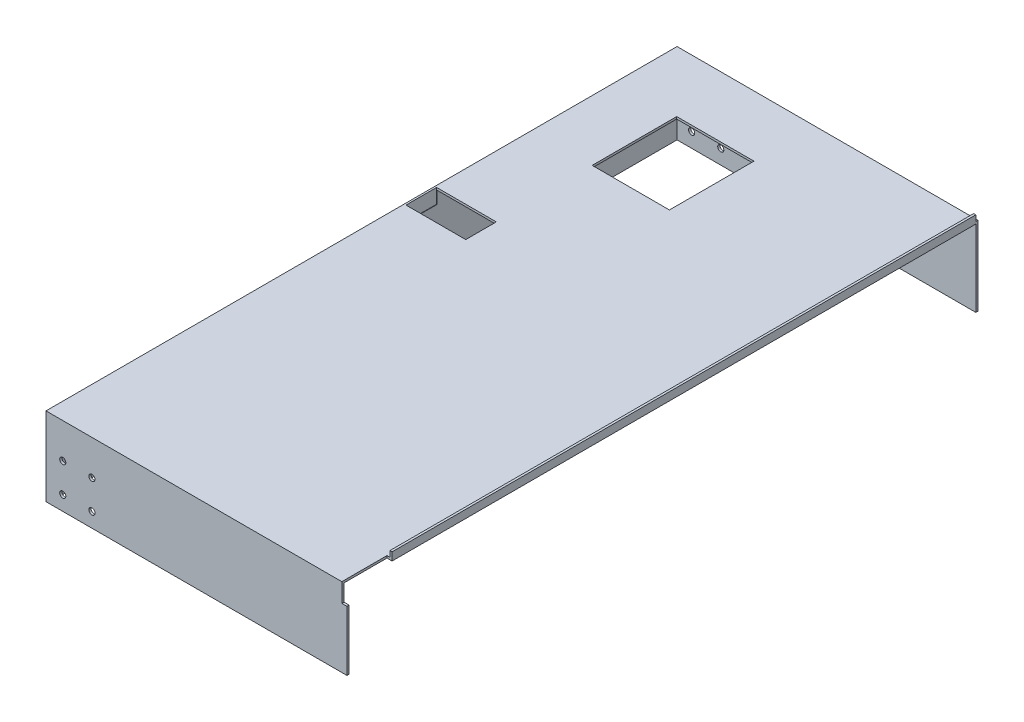
ISO-10303-21;
HEADER;
FILE_DESCRIPTION(('STEP AP214'),'2;1');
FILE_NAME('part.step','',(''),(''),'','','');
FILE_SCHEMA(('AUTOMOTIVE_DESIGN { 1 0 10303 214 1 1 1 1 }'));
ENDSEC;
DATA;
#1=APPLICATION_CONTEXT('core data for automotive mechanical design processes');
#2=APPLICATION_PROTOCOL_DEFINITION('international standard','automotive_design',2000,#1);
#3=PRODUCT_CONTEXT('',#1,'mechanical');
#4=PRODUCT('Part','Part','',(#3));
#5=PRODUCT_RELATED_PRODUCT_CATEGORY('part','',(#4));
#6=PRODUCT_DEFINITION_FORMATION('','',#4);
#7=PRODUCT_DEFINITION_CONTEXT('part definition',#1,'design');
#8=PRODUCT_DEFINITION('design','',#6,#7);
#9=PRODUCT_DEFINITION_SHAPE('','',#8);
#10=(LENGTH_UNIT() NAMED_UNIT(*) SI_UNIT(.MILLI.,.METRE.));
#11=(NAMED_UNIT(*) PLANE_ANGLE_UNIT() SI_UNIT($,.RADIAN.));
#12=(NAMED_UNIT(*) SI_UNIT($,.STERADIAN.) SOLID_ANGLE_UNIT());
#13=UNCERTAINTY_MEASURE_WITH_UNIT(LENGTH_MEASURE(1.E-05),#10,'distance_accuracy_value','');
#14=(GEOMETRIC_REPRESENTATION_CONTEXT(3) GLOBAL_UNCERTAINTY_ASSIGNED_CONTEXT((#13)) GLOBAL_UNIT_ASSIGNED_CONTEXT((#10,
#11,#12)) REPRESENTATION_CONTEXT('',''));
#15=CARTESIAN_POINT('',(0.,0.,0.));
#16=DIRECTION('',(0.,0.,1.));
#17=DIRECTION('',(1.,0.,0.));
#18=AXIS2_PLACEMENT_3D('',#15,#16,#17);
#19=CARTESIAN_POINT('',(329.013477330326,1.5,-430.));
#20=DIRECTION('',(-1.,0.,0.));
#21=DIRECTION('',(0.,0.,1.));
#22=AXIS2_PLACEMENT_3D('',#19,#20,#21);
#23=PLANE('',#22);
#24=DIRECTION('',(0.,1.,0.));
#25=VECTOR('',#24,1.);
#26=CARTESIAN_POINT('',(329.013477330326,6.22834047165099,-29.5));
#27=LINE('',#26,#25);
#28=CARTESIAN_POINT('',(329.013477330326,0.,-29.5));
#29=VERTEX_POINT('',#28);
#30=CARTESIAN_POINT('',(329.013477330326,5.5,-29.5));
#31=VERTEX_POINT('',#30);
#32=EDGE_CURVE('E48',#29,#31,#27,.T.);
#33=ORIENTED_EDGE('',*,*,#32,.F.);
#34=DIRECTION('',(0.,0.,-1.));
#35=VECTOR('',#34,1.);
#36=CARTESIAN_POINT('',(329.013477330326,0.,-430.));
#37=LINE('',#36,#35);
#38=CARTESIAN_POINT('',(329.013477330326,0.,-430.));
#39=VERTEX_POINT('',#38);
#40=EDGE_CURVE('E407',#29,#39,#37,.T.);
#41=ORIENTED_EDGE('',*,*,#40,.T.);
#42=DIRECTION('',(0.,-1.,0.));
#43=VECTOR('',#42,1.);
#44=CARTESIAN_POINT('',(329.013477330326,1.49999999999998,-430.));
#45=LINE('',#44,#43);
#46=CARTESIAN_POINT('',(329.013477330326,-52.5,-430.));
#47=VERTEX_POINT('',#46);
#48=EDGE_CURVE('E358',#39,#47,#45,.T.);
#49=ORIENTED_EDGE('',*,*,#48,.T.);
#50=DIRECTION('',(0.,0.,1.));
#51=VECTOR('',#50,1.);
#52=CARTESIAN_POINT('',(329.013477330326,-52.5,-431.5));
#53=LINE('',#52,#51);
#54=CARTESIAN_POINT('',(329.013477330326,-52.5,-431.5));
#55=VERTEX_POINT('',#54);
#56=EDGE_CURVE('E355',#55,#47,#53,.T.);
#57=ORIENTED_EDGE('',*,*,#56,.F.);
#58=DIRECTION('',(0.,-1.,0.));
#59=VECTOR('',#58,1.);
#60=CARTESIAN_POINT('',(329.013477330326,1.49999999999998,-431.5));
#61=LINE('',#60,#59);
#62=CARTESIAN_POINT('',(329.013477330326,1.49999999999998,-431.5));
#63=VERTEX_POINT('',#62);
#64=EDGE_CURVE('E350',#63,#55,#61,.T.);
#65=ORIENTED_EDGE('',*,*,#64,.F.);
#66=DIRECTION('',(0.,0.,1.));
#67=VECTOR('',#66,1.);
#68=CARTESIAN_POINT('',(329.013477330326,1.49999999999998,-431.5));
#69=LINE('',#68,#67);
#70=CARTESIAN_POINT('',(329.013477330326,1.49999999999998,-430.));
#71=VERTEX_POINT('',#70);
#72=EDGE_CURVE('E368',#63,#71,#69,.T.);
#73=ORIENTED_EDGE('',*,*,#72,.T.);
#74=DIRECTION('',(0.,-1.,0.));
#75=VECTOR('',#74,1.);
#76=CARTESIAN_POINT('',(329.013477330326,1.5,-430.));
#77=LINE('',#76,#75);
#78=CARTESIAN_POINT('',(329.013477330326,5.5,-430.));
#79=VERTEX_POINT('',#78);
#80=EDGE_CURVE('E363',#79,#71,#77,.T.);
#81=ORIENTED_EDGE('',*,*,#80,.F.);
#82=DIRECTION('',(0.,0.,-1.));
#83=VECTOR('',#82,1.);
#84=CARTESIAN_POINT('',(329.013477330326,5.5,0.));
#85=LINE('',#84,#83);
#86=EDGE_CURVE('E372',#31,#79,#85,.T.);
#87=ORIENTED_EDGE('',*,*,#86,.F.);
#88=EDGE_LOOP('',(#33,#41,#49,#57,#65,#73,#81,#87));
#89=FACE_BOUND('',#88,.T.);
#90=ADVANCED_FACE('F33',(#89),#23,.F.);
#91=CARTESIAN_POINT('',(327.513477330326,5.5,0.));
#92=DIRECTION('',(1.,0.,0.));
#93=DIRECTION('',(0.,0.,-1.));
#94=AXIS2_PLACEMENT_3D('',#91,#92,#93);
#95=PLANE('',#94);
#96=DIRECTION('',(0.,-1.,0.));
#97=VECTOR('',#96,1.);
#98=CARTESIAN_POINT('',(327.513477330326,5.5,-29.5));
#99=LINE('',#98,#97);
#100=CARTESIAN_POINT('',(327.513477330326,5.5,-29.5));
#101=VERTEX_POINT('',#100);
#102=CARTESIAN_POINT('',(327.513477330326,1.5,-29.5));
#103=VERTEX_POINT('',#102);
#104=EDGE_CURVE('E229',#101,#103,#99,.T.);
#105=ORIENTED_EDGE('',*,*,#104,.F.);
#106=DIRECTION('',(0.,0.,1.));
#107=VECTOR('',#106,1.);
#108=CARTESIAN_POINT('',(327.513477330326,5.5,0.));
#109=LINE('',#108,#107);
#110=CARTESIAN_POINT('',(327.513477330326,5.5,-430.));
#111=VERTEX_POINT('',#110);
#112=EDGE_CURVE('E376',#111,#101,#109,.T.);
#113=ORIENTED_EDGE('',*,*,#112,.F.);
#114=DIRECTION('',(0.,-1.,0.));
#115=VECTOR('',#114,1.);
#116=CARTESIAN_POINT('',(327.513477330326,5.5,-430.));
#117=LINE('',#116,#115);
#118=CARTESIAN_POINT('',(327.513477330326,1.5,-430.));
#119=VERTEX_POINT('',#118);
#120=EDGE_CURVE('E379',#111,#119,#117,.T.);
#121=ORIENTED_EDGE('',*,*,#120,.T.);
#122=DIRECTION('',(0.,0.,1.));
#123=VECTOR('',#122,1.);
#124=CARTESIAN_POINT('',(327.513477330326,1.5,0.));
#125=LINE('',#124,#123);
#126=EDGE_CURVE('E371',#119,#103,#125,.T.);
#127=ORIENTED_EDGE('',*,*,#126,.T.);
#128=EDGE_LOOP('',(#105,#113,#121,#127));
#129=FACE_BOUND('',#128,.T.);
#130=ADVANCED_FACE('F453',(#129),#95,.F.);
#131=CARTESIAN_POINT('',(0.,5.5,0.));
#132=DIRECTION('',(0.,1.,0.));
#133=DIRECTION('',(0.,0.,1.));
#134=AXIS2_PLACEMENT_3D('',#131,#132,#133);
#135=PLANE('',#134);
#136=ORIENTED_EDGE('',*,*,#112,.T.);
#137=DIRECTION('',(1.,0.,0.));
#138=VECTOR('',#137,1.);
#139=CARTESIAN_POINT('',(0.,5.5,-29.5));
#140=LINE('',#139,#138);
#141=EDGE_CURVE('E41',#101,#31,#140,.T.);
#142=ORIENTED_EDGE('',*,*,#141,.T.);
#143=ORIENTED_EDGE('',*,*,#86,.T.);
#144=DIRECTION('',(-1.,0.,0.));
#145=VECTOR('',#144,1.);
#146=CARTESIAN_POINT('',(329.013477330326,5.5,-430.));
#147=LINE('',#146,#145);
#148=EDGE_CURVE('E374',#79,#111,#147,.T.);
#149=ORIENTED_EDGE('',*,*,#148,.T.);
#150=EDGE_LOOP('',(#136,#142,#143,#149));
#151=FACE_BOUND('',#150,.T.);
#152=ADVANCED_FACE('F439',(#151),#135,.T.);
#153=CARTESIAN_POINT('',(124.013477330326,1.5,-430.));
#154=DIRECTION('',(0.,0.,1.));
#155=DIRECTION('',(1.,0.,0.));
#156=AXIS2_PLACEMENT_3D('',#153,#154,#155);
#157=PLANE('',#156);
#158=DIRECTION('',(1.,0.,0.));
#159=VECTOR('',#158,1.);
#160=CARTESIAN_POINT('',(124.013477330326,1.5,-430.));
#161=LINE('',#160,#159);
#162=EDGE_CURVE('E359',#119,#71,#161,.T.);
#163=ORIENTED_EDGE('',*,*,#162,.F.);
#164=ORIENTED_EDGE('',*,*,#120,.F.);
#165=ORIENTED_EDGE('',*,*,#148,.F.);
#166=ORIENTED_EDGE('',*,*,#80,.T.);
#167=EDGE_LOOP('',(#163,#164,#165,#166));
#168=FACE_BOUND('',#167,.T.);
#169=ADVANCED_FACE('F450',(#168),#157,.F.);
#170=CARTESIAN_POINT('',(0.,1.5,0.));
#171=DIRECTION('',(0.,-1.,0.));
#172=DIRECTION('',(0.,0.,-1.));
#173=AXIS2_PLACEMENT_3D('',#170,#171,#172);
#174=PLANE('',#173);
#175=DIRECTION('',(1.,0.,0.));
#176=VECTOR('',#175,1.);
#177=CARTESIAN_POINT('',(164.013477330328,1.5,-331.765424222286));
#178=LINE('',#177,#176);
#179=CARTESIAN_POINT('',(164.013477330328,1.5,-331.765424222286));
#180=VERTEX_POINT('',#179);
#181=CARTESIAN_POINT('',(217.013477330328,1.5,-331.765424222286));
#182=VERTEX_POINT('',#181);
#183=EDGE_CURVE('E244',#180,#182,#178,.T.);
#184=ORIENTED_EDGE('',*,*,#183,.F.);
#185=DIRECTION('',(0.,0.,1.));
#186=VECTOR('',#185,1.);
#187=CARTESIAN_POINT('',(164.013477330328,1.5,-389.765424222286));
#188=LINE('',#187,#186);
#189=CARTESIAN_POINT('',(164.013477330328,1.5,-389.765424222286));
#190=VERTEX_POINT('',#189);
#191=EDGE_CURVE('E56',#190,#180,#188,.T.);
#192=ORIENTED_EDGE('',*,*,#191,.F.);
#193=DIRECTION('',(-1.,0.,0.));
#194=VECTOR('',#193,1.);
#195=CARTESIAN_POINT('',(164.013477330328,1.5,-389.765424222286));
#196=LINE('',#195,#194);
#197=CARTESIAN_POINT('',(217.013477330328,1.5,-389.765424222286));
#198=VERTEX_POINT('',#197);
#199=EDGE_CURVE('E250',#198,#190,#196,.T.);
#200=ORIENTED_EDGE('',*,*,#199,.F.);
#201=DIRECTION('',(0.,0.,-1.));
#202=VECTOR('',#201,1.);
#203=CARTESIAN_POINT('',(217.013477330328,1.5,-389.765424222286));
#204=LINE('',#203,#202);
#205=EDGE_CURVE('E247',#182,#198,#204,.T.);
#206=ORIENTED_EDGE('',*,*,#205,.F.);
#207=EDGE_LOOP('',(#184,#192,#200,#206));
#208=FACE_BOUND('',#207,.T.);
#209=DIRECTION('',(1.,0.,0.));
#210=VECTOR('',#209,1.);
#211=CARTESIAN_POINT('',(123.735269619214,1.5,-244.277623749765));
#212=LINE('',#211,#210);
#213=CARTESIAN_POINT('',(123.735269619214,1.5,-244.277623749765));
#214=VERTEX_POINT('',#213);
#215=CARTESIAN_POINT('',(164.735269619214,1.5,-244.277623749765));
#216=VERTEX_POINT('',#215);
#217=EDGE_CURVE('E272',#214,#216,#212,.T.);
#218=ORIENTED_EDGE('',*,*,#217,.F.);
#219=DIRECTION('',(0.,0.,1.));
#220=VECTOR('',#219,1.);
#221=CARTESIAN_POINT('',(123.735269619214,1.5,-265.281270003223));
#222=LINE('',#221,#220);
#223=CARTESIAN_POINT('',(123.735269619214,1.5,-265.281270003223));
#224=VERTEX_POINT('',#223);
#225=EDGE_CURVE('E256',#224,#214,#222,.T.);
#226=ORIENTED_EDGE('',*,*,#225,.F.);
#227=DIRECTION('',(-1.,0.,0.));
#228=VECTOR('',#227,1.);
#229=CARTESIAN_POINT('',(123.735269619214,1.5,-265.281270003223));
#230=LINE('',#229,#228);
#231=CARTESIAN_POINT('',(164.735269619214,1.5,-265.281270003223));
#232=VERTEX_POINT('',#231);
#233=EDGE_CURVE('E266',#232,#224,#230,.T.);
#234=ORIENTED_EDGE('',*,*,#233,.F.);
#235=DIRECTION('',(0.,0.,-1.));
#236=VECTOR('',#235,1.);
#237=CARTESIAN_POINT('',(164.735269619214,1.5,-265.281270003223));
#238=LINE('',#237,#236);
#239=EDGE_CURVE('E275',#216,#232,#238,.T.);
#240=ORIENTED_EDGE('',*,*,#239,.F.);
#241=EDGE_LOOP('',(#218,#226,#234,#240));
#242=FACE_BOUND('',#241,.T.);
#243=DIRECTION('',(-1.,0.,0.));
#244=VECTOR('',#243,1.);
#245=CARTESIAN_POINT('',(124.013477330326,1.5,1.5));
#246=LINE('',#245,#244);
#247=CARTESIAN_POINT('',(325.500328554849,1.5,1.5));
#248=VERTEX_POINT('',#247);
#249=CARTESIAN_POINT('',(122.513477330326,1.5,1.50000000000003));
#250=VERTEX_POINT('',#249);
#251=EDGE_CURVE('E389',#248,#250,#246,.T.);
#252=ORIENTED_EDGE('',*,*,#251,.F.);
#253=DIRECTION('',(0.,0.,-1.));
#254=VECTOR('',#253,1.);
#255=CARTESIAN_POINT('',(325.500328554849,1.5,0.));
#256=LINE('',#255,#254);
#257=CARTESIAN_POINT('',(325.500328554849,1.5,-29.5));
#258=VERTEX_POINT('',#257);
#259=EDGE_CURVE('E206',#248,#258,#256,.T.);
#260=ORIENTED_EDGE('',*,*,#259,.T.);
#261=DIRECTION('',(-1.,0.,0.));
#262=VECTOR('',#261,1.);
#263=CARTESIAN_POINT('',(0.,1.5,-29.5));
#264=LINE('',#263,#262);
#265=EDGE_CURVE('E232',#103,#258,#264,.T.);
#266=ORIENTED_EDGE('',*,*,#265,.F.);
#267=ORIENTED_EDGE('',*,*,#126,.F.);
#268=ORIENTED_EDGE('',*,*,#162,.T.);
#269=ORIENTED_EDGE('',*,*,#72,.F.);
#270=DIRECTION('',(1.,0.,0.));
#271=VECTOR('',#270,1.);
#272=CARTESIAN_POINT('',(124.013477330326,1.5,-431.5));
#273=LINE('',#272,#271);
#274=CARTESIAN_POINT('',(122.513477330326,1.5,-431.5));
#275=VERTEX_POINT('',#274);
#276=EDGE_CURVE('E348',#275,#63,#273,.T.);
#277=ORIENTED_EDGE('',*,*,#276,.F.);
#278=DIRECTION('',(0.,0.,-1.));
#279=VECTOR('',#278,1.);
#280=CARTESIAN_POINT('',(122.513477330326,1.5,-431.5));
#281=LINE('',#280,#279);
#282=EDGE_CURVE('E342',#250,#275,#281,.T.);
#283=ORIENTED_EDGE('',*,*,#282,.F.);
#284=EDGE_LOOP('',(#252,#260,#266,#267,#268,#269,#277,#283));
#285=FACE_BOUND('',#284,.T.);
#286=ADVANCED_FACE('F457',(#208,#242,#285),#174,.F.);
#287=DIRECTION('',(0.,1.,0.));
#288=VECTOR('',#287,1.);
#289=CARTESIAN_POINT('',(329.013477330326,1.5,0.));
#290=LINE('',#289,#288);
#291=CARTESIAN_POINT('',(329.013477330326,-52.5,0.));
#292=VERTEX_POINT('',#291);
#293=CARTESIAN_POINT('',(329.013477330326,-11.4156187461134,0.));
#294=VERTEX_POINT('',#293);
#295=EDGE_CURVE('E387',#292,#294,#290,.T.);
#296=ORIENTED_EDGE('',*,*,#295,.T.);
#297=DIRECTION('',(0.,0.,1.));
#298=VECTOR('',#297,1.);
#299=CARTESIAN_POINT('',(329.013477330326,-11.4156187461134,-29.5));
#300=LINE('',#299,#298);
#301=CARTESIAN_POINT('',(329.013477330326,-11.4156187461134,1.5));
#302=VERTEX_POINT('',#301);
#303=EDGE_CURVE('E216',#294,#302,#300,.T.);
#304=ORIENTED_EDGE('',*,*,#303,.T.);
#305=DIRECTION('',(0.,1.,0.));
#306=VECTOR('',#305,1.);
#307=CARTESIAN_POINT('',(329.013477330326,1.5,1.5));
#308=LINE('',#307,#306);
#309=CARTESIAN_POINT('',(329.013477330326,-52.5,1.5));
#310=VERTEX_POINT('',#309);
#311=EDGE_CURVE('E222',#310,#302,#308,.T.);
#312=ORIENTED_EDGE('',*,*,#311,.F.);
#313=DIRECTION('',(0.,0.,-1.));
#314=VECTOR('',#313,1.);
#315=CARTESIAN_POINT('',(329.013477330326,-52.5,1.5));
#316=LINE('',#315,#314);
#317=EDGE_CURVE('E391',#310,#292,#316,.T.);
#318=ORIENTED_EDGE('',*,*,#317,.T.);
#319=EDGE_LOOP('',(#296,#304,#312,#318));
#320=FACE_BOUND('',#319,.T.);
#321=ADVANCED_FACE('F35',(#320),#23,.F.);
#322=CARTESIAN_POINT('',(0.,0.,0.));
#323=DIRECTION('',(0.,-1.,0.));
#324=DIRECTION('',(0.,0.,-1.));
#325=AXIS2_PLACEMENT_3D('',#322,#323,#324);
#326=PLANE('',#325);
#327=DIRECTION('',(0.,0.,-1.));
#328=VECTOR('',#327,1.);
#329=CARTESIAN_POINT('',(325.500328554849,0.,0.));
#330=LINE('',#329,#328);
#331=CARTESIAN_POINT('',(325.500328554849,0.,0.));
#332=VERTEX_POINT('',#331);
#333=CARTESIAN_POINT('',(325.500328554849,0.,-29.5));
#334=VERTEX_POINT('',#333);
#335=EDGE_CURVE('E240',#332,#334,#330,.T.);
#336=ORIENTED_EDGE('',*,*,#335,.F.);
#337=DIRECTION('',(1.,0.,0.));
#338=VECTOR('',#337,1.);
#339=CARTESIAN_POINT('',(329.013477330326,0.,0.));
#340=LINE('',#339,#338);
#341=CARTESIAN_POINT('',(124.013477330326,0.,0.));
#342=VERTEX_POINT('',#341);
#343=EDGE_CURVE('E404',#342,#332,#340,.T.);
#344=ORIENTED_EDGE('',*,*,#343,.F.);
#345=DIRECTION('',(0.,0.,1.));
#346=VECTOR('',#345,1.);
#347=CARTESIAN_POINT('',(124.013477330326,0.,0.));
#348=LINE('',#347,#346);
#349=CARTESIAN_POINT('',(124.013477330326,0.,-244.277623749765));
#350=VERTEX_POINT('',#349);
#351=EDGE_CURVE('E400',#350,#342,#348,.T.);
#352=ORIENTED_EDGE('',*,*,#351,.F.);
#353=DIRECTION('',(-1.,0.,0.));
#354=VECTOR('',#353,1.);
#355=CARTESIAN_POINT('',(0.,0.,-244.277623749765));
#356=LINE('',#355,#354);
#357=CARTESIAN_POINT('',(164.735269619214,0.,-244.277623749765));
#358=VERTEX_POINT('',#357);
#359=EDGE_CURVE('E282',#358,#350,#356,.T.);
#360=ORIENTED_EDGE('',*,*,#359,.F.);
#361=DIRECTION('',(0.,0.,1.));
#362=VECTOR('',#361,1.);
#363=CARTESIAN_POINT('',(164.735269619214,0.,0.));
#364=LINE('',#363,#362);
#365=CARTESIAN_POINT('',(164.735269619214,0.,-265.281270003223));
#366=VERTEX_POINT('',#365);
#367=EDGE_CURVE('E427',#366,#358,#364,.T.);
#368=ORIENTED_EDGE('',*,*,#367,.F.);
#369=DIRECTION('',(1.,0.,0.));
#370=VECTOR('',#369,1.);
#371=CARTESIAN_POINT('',(0.,0.,-265.281270003223));
#372=LINE('',#371,#370);
#373=CARTESIAN_POINT('',(124.013477330326,0.,-265.281270003223));
#374=VERTEX_POINT('',#373);
#375=EDGE_CURVE('E290',#374,#366,#372,.T.);
#376=ORIENTED_EDGE('',*,*,#375,.F.);
#377=CARTESIAN_POINT('',(124.013477330326,0.,-430.));
#378=VERTEX_POINT('',#377);
#379=EDGE_CURVE('E401',#378,#374,#348,.T.);
#380=ORIENTED_EDGE('',*,*,#379,.F.);
#381=DIRECTION('',(-1.,0.,0.));
#382=VECTOR('',#381,1.);
#383=CARTESIAN_POINT('',(124.013477330326,0.,-430.));
#384=LINE('',#383,#382);
#385=EDGE_CURVE('E409',#39,#378,#384,.T.);
#386=ORIENTED_EDGE('',*,*,#385,.F.);
#387=ORIENTED_EDGE('',*,*,#40,.F.);
#388=DIRECTION('',(-1.,0.,0.));
#389=VECTOR('',#388,1.);
#390=CARTESIAN_POINT('',(0.,0.,-29.5));
#391=LINE('',#390,#389);
#392=EDGE_CURVE('E234',#29,#334,#391,.T.);
#393=ORIENTED_EDGE('',*,*,#392,.T.);
#394=EDGE_LOOP('',(#336,#344,#352,#360,#368,#376,#380,#386,#387,#393));
#395=FACE_BOUND('',#394,.T.);
#396=DIRECTION('',(0.,0.,-1.));
#397=VECTOR('',#396,1.);
#398=CARTESIAN_POINT('',(164.013477330328,0.,0.));
#399=LINE('',#398,#397);
#400=CARTESIAN_POINT('',(164.013477330328,0.,-331.765424222286));
#401=VERTEX_POINT('',#400);
#402=CARTESIAN_POINT('',(164.013477330328,0.,-389.765424222286));
#403=VERTEX_POINT('',#402);
#404=EDGE_CURVE('E436',#401,#403,#399,.T.);
#405=ORIENTED_EDGE('',*,*,#404,.F.);
#406=DIRECTION('',(-1.,0.,0.));
#407=VECTOR('',#406,1.);
#408=CARTESIAN_POINT('',(0.,0.,-331.765424222286));
#409=LINE('',#408,#407);
#410=CARTESIAN_POINT('',(217.013477330328,0.,-331.765424222286));
#411=VERTEX_POINT('',#410);
#412=EDGE_CURVE('E429',#411,#401,#409,.T.);
#413=ORIENTED_EDGE('',*,*,#412,.F.);
#414=DIRECTION('',(0.,0.,1.));
#415=VECTOR('',#414,1.);
#416=CARTESIAN_POINT('',(217.013477330328,0.,0.));
#417=LINE('',#416,#415);
#418=CARTESIAN_POINT('',(217.013477330328,0.,-389.765424222286));
#419=VERTEX_POINT('',#418);
#420=EDGE_CURVE('E431',#419,#411,#417,.T.);
#421=ORIENTED_EDGE('',*,*,#420,.F.);
#422=DIRECTION('',(1.,0.,0.));
#423=VECTOR('',#422,1.);
#424=CARTESIAN_POINT('',(0.,0.,-389.765424222286));
#425=LINE('',#424,#423);
#426=EDGE_CURVE('E434',#403,#419,#425,.T.);
#427=ORIENTED_EDGE('',*,*,#426,.F.);
#428=EDGE_LOOP('',(#405,#413,#421,#427));
#429=FACE_BOUND('',#428,.T.);
#430=ADVANCED_FACE('F476',(#395,#429),#326,.T.);
#431=CARTESIAN_POINT('',(0.,0.,0.));
#432=DIRECTION('',(0.,0.,1.));
#433=DIRECTION('',(1.,0.,0.));
#434=AXIS2_PLACEMENT_3D('',#431,#432,#433);
#435=PLANE('',#434);
#436=CARTESIAN_POINT('',(154.003183788677,-22.5144245892482,0.));
#437=DIRECTION('',(0.,0.,1.));
#438=DIRECTION('',(1.,0.,0.));
#439=AXIS2_PLACEMENT_3D('',#436,#437,#438);
#440=CIRCLE('',#439,2.09999999999999);
#441=CARTESIAN_POINT('',(156.103183788677,-22.5144245892482,0.));
#442=VERTEX_POINT('',#441);
#443=EDGE_CURVE('E295',#442,#442,#440,.T.);
#444=ORIENTED_EDGE('',*,*,#443,.T.);
#445=EDGE_LOOP('',(#444));
#446=FACE_BOUND('',#445,.T.);
#447=CARTESIAN_POINT('',(134.017306734295,-22.4773412230547,0.));
#448=DIRECTION('',(0.,0.,1.));
#449=DIRECTION('',(1.,0.,0.));
#450=AXIS2_PLACEMENT_3D('',#447,#448,#449);
#451=CIRCLE('',#450,2.09999999999999);
#452=CARTESIAN_POINT('',(136.117306734295,-22.4773412230547,0.));
#453=VERTEX_POINT('',#452);
#454=EDGE_CURVE('E301',#453,#453,#451,.T.);
#455=ORIENTED_EDGE('',*,*,#454,.T.);
#456=EDGE_LOOP('',(#455));
#457=FACE_BOUND('',#456,.T.);
#458=CARTESIAN_POINT('',(134.023652304269,-42.5218362285769,0.));
#459=DIRECTION('',(0.,0.,1.));
#460=DIRECTION('',(1.,0.,0.));
#461=AXIS2_PLACEMENT_3D('',#458,#459,#460);
#462=CIRCLE('',#461,2.09999999999999);
#463=CARTESIAN_POINT('',(136.123652304269,-42.5218362285769,0.));
#464=VERTEX_POINT('',#463);
#465=EDGE_CURVE('E319',#464,#464,#462,.T.);
#466=ORIENTED_EDGE('',*,*,#465,.T.);
#467=EDGE_LOOP('',(#466));
#468=FACE_BOUND('',#467,.T.);
#469=CARTESIAN_POINT('',(154.013477330328,-42.5,0.));
#470=DIRECTION('',(0.,0.,1.));
#471=DIRECTION('',(1.,0.,0.));
#472=AXIS2_PLACEMENT_3D('',#469,#470,#471);
#473=CIRCLE('',#472,2.09999999999999);
#474=CARTESIAN_POINT('',(156.113477330328,-42.5,0.));
#475=VERTEX_POINT('',#474);
#476=EDGE_CURVE('E325',#475,#475,#473,.T.);
#477=ORIENTED_EDGE('',*,*,#476,.T.);
#478=EDGE_LOOP('',(#477));
#479=FACE_BOUND('',#478,.T.);
#480=ORIENTED_EDGE('',*,*,#343,.T.);
#481=DIRECTION('',(0.,-1.,0.));
#482=VECTOR('',#481,1.);
#483=CARTESIAN_POINT('',(325.500328554849,0.,0.));
#484=LINE('',#483,#482);
#485=CARTESIAN_POINT('',(325.500328554849,-11.4156187461134,0.));
#486=VERTEX_POINT('',#485);
#487=EDGE_CURVE('E238',#332,#486,#484,.T.);
#488=ORIENTED_EDGE('',*,*,#487,.T.);
#489=DIRECTION('',(1.,0.,0.));
#490=VECTOR('',#489,1.);
#491=CARTESIAN_POINT('',(0.,-11.4156187461134,0.));
#492=LINE('',#491,#490);
#493=EDGE_CURVE('E215',#486,#294,#492,.T.);
#494=ORIENTED_EDGE('',*,*,#493,.T.);
#495=ORIENTED_EDGE('',*,*,#295,.F.);
#496=DIRECTION('',(1.,0.,0.));
#497=VECTOR('',#496,1.);
#498=CARTESIAN_POINT('',(124.013477330326,-52.5,0.));
#499=LINE('',#498,#497);
#500=CARTESIAN_POINT('',(124.013477330326,-52.5,0.));
#501=VERTEX_POINT('',#500);
#502=EDGE_CURVE('E394',#501,#292,#499,.T.);
#503=ORIENTED_EDGE('',*,*,#502,.F.);
#504=DIRECTION('',(0.,-1.,0.));
#505=VECTOR('',#504,1.);
#506=CARTESIAN_POINT('',(124.013477330326,1.5,0.));
#507=LINE('',#506,#505);
#508=EDGE_CURVE('E384',#342,#501,#507,.T.);
#509=ORIENTED_EDGE('',*,*,#508,.F.);
#510=EDGE_LOOP('',(#480,#488,#494,#495,#503,#509));
#511=FACE_BOUND('',#510,.T.);
#512=ADVANCED_FACE('F471',(#446,#457,#468,#479,#511),#435,.F.);
#513=CARTESIAN_POINT('',(124.013477330326,-52.5,1.5));
#514=DIRECTION('',(0.,1.,0.));
#515=DIRECTION('',(0.,0.,1.));
#516=AXIS2_PLACEMENT_3D('',#513,#514,#515);
#517=PLANE('',#516);
#518=ORIENTED_EDGE('',*,*,#502,.T.);
#519=ORIENTED_EDGE('',*,*,#317,.F.);
#520=DIRECTION('',(1.,0.,0.));
#521=VECTOR('',#520,1.);
#522=CARTESIAN_POINT('',(124.013477330326,-52.5,1.5));
#523=LINE('',#522,#521);
#524=CARTESIAN_POINT('',(122.513477330326,-52.5,1.50000000000003));
#525=VERTEX_POINT('',#524);
#526=EDGE_CURVE('E385',#525,#310,#523,.T.);
#527=ORIENTED_EDGE('',*,*,#526,.F.);
#528=DIRECTION('',(0.,0.,1.));
#529=VECTOR('',#528,1.);
#530=CARTESIAN_POINT('',(122.513477330326,-52.5,-431.5));
#531=LINE('',#530,#529);
#532=CARTESIAN_POINT('',(122.513477330326,-52.5,-431.5));
#533=VERTEX_POINT('',#532);
#534=EDGE_CURVE('E335',#533,#525,#531,.T.);
#535=ORIENTED_EDGE('',*,*,#534,.F.);
#536=DIRECTION('',(-1.,0.,0.));
#537=VECTOR('',#536,1.);
#538=CARTESIAN_POINT('',(124.013477330326,-52.5,-431.5));
#539=LINE('',#538,#537);
#540=EDGE_CURVE('E353',#55,#533,#539,.T.);
#541=ORIENTED_EDGE('',*,*,#540,.F.);
#542=ORIENTED_EDGE('',*,*,#56,.T.);
#543=DIRECTION('',(-1.,0.,0.));
#544=VECTOR('',#543,1.);
#545=CARTESIAN_POINT('',(124.013477330326,-52.5,-430.));
#546=LINE('',#545,#544);
#547=CARTESIAN_POINT('',(124.013477330326,-52.5,-430.));
#548=VERTEX_POINT('',#547);
#549=EDGE_CURVE('E351',#47,#548,#546,.T.);
#550=ORIENTED_EDGE('',*,*,#549,.T.);
#551=DIRECTION('',(0.,0.,1.));
#552=VECTOR('',#551,1.);
#553=CARTESIAN_POINT('',(124.013477330326,-52.5,-431.5));
#554=LINE('',#553,#552);
#555=EDGE_CURVE('E336',#548,#501,#554,.T.);
#556=ORIENTED_EDGE('',*,*,#555,.T.);
#557=EDGE_LOOP('',(#518,#519,#527,#535,#541,#542,#550,#556));
#558=FACE_BOUND('',#557,.T.);
#559=ADVANCED_FACE('F466',(#558),#517,.F.);
#560=CARTESIAN_POINT('',(0.,0.,1.5));
#561=DIRECTION('',(0.,0.,1.));
#562=DIRECTION('',(1.,0.,0.));
#563=AXIS2_PLACEMENT_3D('',#560,#561,#562);
#564=PLANE('',#563);
#565=DIRECTION('',(0.,-1.,0.));
#566=VECTOR('',#565,1.);
#567=CARTESIAN_POINT('',(325.500328554849,0.,1.5));
#568=LINE('',#567,#566);
#569=CARTESIAN_POINT('',(325.500328554849,-11.4156187461134,1.5));
#570=VERTEX_POINT('',#569);
#571=EDGE_CURVE('E11',#248,#570,#568,.T.);
#572=ORIENTED_EDGE('',*,*,#571,.F.);
#573=ORIENTED_EDGE('',*,*,#251,.T.);
#574=DIRECTION('',(0.,1.,0.));
#575=VECTOR('',#574,1.);
#576=CARTESIAN_POINT('',(122.513477330326,1.5,1.50000000000003));
#577=LINE('',#576,#575);
#578=EDGE_CURVE('E339',#525,#250,#577,.T.);
#579=ORIENTED_EDGE('',*,*,#578,.F.);
#580=ORIENTED_EDGE('',*,*,#526,.T.);
#581=ORIENTED_EDGE('',*,*,#311,.T.);
#582=DIRECTION('',(1.,0.,0.));
#583=VECTOR('',#582,1.);
#584=CARTESIAN_POINT('',(325.500328554849,-11.4156187461134,1.5));
#585=LINE('',#584,#583);
#586=EDGE_CURVE('E212',#570,#302,#585,.T.);
#587=ORIENTED_EDGE('',*,*,#586,.F.);
#588=EDGE_LOOP('',(#572,#573,#579,#580,#581,#587));
#589=FACE_BOUND('',#588,.T.);
#590=CARTESIAN_POINT('',(154.003183788677,-22.5144245892482,1.5));
#591=DIRECTION('',(0.,0.,1.));
#592=DIRECTION('',(1.,0.,0.));
#593=AXIS2_PLACEMENT_3D('',#590,#591,#592);
#594=CIRCLE('',#593,2.09999999999999);
#595=CARTESIAN_POINT('',(156.103183788677,-22.5144245892482,1.5));
#596=VERTEX_POINT('',#595);
#597=EDGE_CURVE('E292',#596,#596,#594,.T.);
#598=ORIENTED_EDGE('',*,*,#597,.F.);
#599=EDGE_LOOP('',(#598));
#600=FACE_BOUND('',#599,.T.);
#601=CARTESIAN_POINT('',(134.017306734295,-22.4773412230547,1.5));
#602=DIRECTION('',(0.,0.,1.));
#603=DIRECTION('',(1.,0.,0.));
#604=AXIS2_PLACEMENT_3D('',#601,#602,#603);
#605=CIRCLE('',#604,2.09999999999999);
#606=CARTESIAN_POINT('',(136.117306734295,-22.4773412230547,1.5));
#607=VERTEX_POINT('',#606);
#608=EDGE_CURVE('E298',#607,#607,#605,.T.);
#609=ORIENTED_EDGE('',*,*,#608,.F.);
#610=EDGE_LOOP('',(#609));
#611=FACE_BOUND('',#610,.T.);
#612=CARTESIAN_POINT('',(134.023652304269,-42.5218362285769,1.5));
#613=DIRECTION('',(0.,0.,1.));
#614=DIRECTION('',(1.,0.,0.));
#615=AXIS2_PLACEMENT_3D('',#612,#613,#614);
#616=CIRCLE('',#615,2.09999999999999);
#617=CARTESIAN_POINT('',(136.123652304269,-42.5218362285769,1.5));
#618=VERTEX_POINT('',#617);
#619=EDGE_CURVE('E316',#618,#618,#616,.T.);
#620=ORIENTED_EDGE('',*,*,#619,.F.);
#621=EDGE_LOOP('',(#620));
#622=FACE_BOUND('',#621,.T.);
#623=CARTESIAN_POINT('',(154.013477330328,-42.5,1.5));
#624=DIRECTION('',(0.,0.,1.));
#625=DIRECTION('',(1.,0.,0.));
#626=AXIS2_PLACEMENT_3D('',#623,#624,#625);
#627=CIRCLE('',#626,2.09999999999999);
#628=CARTESIAN_POINT('',(156.113477330328,-42.5,1.5));
#629=VERTEX_POINT('',#628);
#630=EDGE_CURVE('E322',#629,#629,#627,.T.);
#631=ORIENTED_EDGE('',*,*,#630,.F.);
#632=EDGE_LOOP('',(#631));
#633=FACE_BOUND('',#632,.T.);
#634=ADVANCED_FACE('F219',(#589,#600,#611,#622,#633),#564,.T.);
#635=CARTESIAN_POINT('',(0.,0.,-431.5));
#636=DIRECTION('',(0.,0.,1.));
#637=DIRECTION('',(1.,0.,0.));
#638=AXIS2_PLACEMENT_3D('',#635,#636,#637);
#639=PLANE('',#638);
#640=CARTESIAN_POINT('',(154.003183788677,-22.5144245892482,-431.5));
#641=DIRECTION('',(0.,0.,-1.));
#642=DIRECTION('',(-1.,0.,0.));
#643=AXIS2_PLACEMENT_3D('',#640,#641,#642);
#644=CIRCLE('',#643,2.09999999999999);
#645=CARTESIAN_POINT('',(151.903183788677,-22.5144245892482,-431.5));
#646=VERTEX_POINT('',#645);
#647=EDGE_CURVE('E304',#646,#646,#644,.T.);
#648=ORIENTED_EDGE('',*,*,#647,.F.);
#649=EDGE_LOOP('',(#648));
#650=FACE_BOUND('',#649,.T.);
#651=CARTESIAN_POINT('',(134.017306734295,-22.4773412230547,-431.5));
#652=DIRECTION('',(0.,0.,-1.));
#653=DIRECTION('',(-1.,0.,0.));
#654=AXIS2_PLACEMENT_3D('',#651,#652,#653);
#655=CIRCLE('',#654,2.09999999999999);
#656=CARTESIAN_POINT('',(131.917306734295,-22.4773412230547,-431.5));
#657=VERTEX_POINT('',#656);
#658=EDGE_CURVE('E308',#657,#657,#655,.T.);
#659=ORIENTED_EDGE('',*,*,#658,.F.);
#660=EDGE_LOOP('',(#659));
#661=FACE_BOUND('',#660,.T.);
#662=CARTESIAN_POINT('',(134.023652304269,-42.5218362285769,-431.5));
#663=DIRECTION('',(0.,0.,-1.));
#664=DIRECTION('',(-1.,0.,0.));
#665=AXIS2_PLACEMENT_3D('',#662,#663,#664);
#666=CIRCLE('',#665,2.09999999999999);
#667=CARTESIAN_POINT('',(131.923652304269,-42.5218362285769,-431.5));
#668=VERTEX_POINT('',#667);
#669=EDGE_CURVE('E312',#668,#668,#666,.T.);
#670=ORIENTED_EDGE('',*,*,#669,.F.);
#671=EDGE_LOOP('',(#670));
#672=FACE_BOUND('',#671,.T.);
#673=CARTESIAN_POINT('',(154.013477330328,-42.5,-431.5));
#674=DIRECTION('',(0.,0.,-1.));
#675=DIRECTION('',(-1.,0.,0.));
#676=AXIS2_PLACEMENT_3D('',#673,#674,#675);
#677=CIRCLE('',#676,2.09999999999999);
#678=CARTESIAN_POINT('',(151.913477330328,-42.5,-431.5));
#679=VERTEX_POINT('',#678);
#680=EDGE_CURVE('E328',#679,#679,#677,.T.);
#681=ORIENTED_EDGE('',*,*,#680,.F.);
#682=EDGE_LOOP('',(#681));
#683=FACE_BOUND('',#682,.T.);
#684=ORIENTED_EDGE('',*,*,#540,.T.);
#685=DIRECTION('',(0.,-1.,0.));
#686=VECTOR('',#685,1.);
#687=CARTESIAN_POINT('',(122.513477330326,1.5,-431.5));
#688=LINE('',#687,#686);
#689=EDGE_CURVE('E332',#275,#533,#688,.T.);
#690=ORIENTED_EDGE('',*,*,#689,.F.);
#691=ORIENTED_EDGE('',*,*,#276,.T.);
#692=ORIENTED_EDGE('',*,*,#64,.T.);
#693=EDGE_LOOP('',(#684,#690,#691,#692));
#694=FACE_BOUND('',#693,.T.);
#695=ADVANCED_FACE('F539',(#650,#661,#672,#683,#694),#639,.F.);
#696=CARTESIAN_POINT('',(0.,0.,-430.));
#697=DIRECTION('',(0.,0.,1.));
#698=DIRECTION('',(1.,0.,0.));
#699=AXIS2_PLACEMENT_3D('',#696,#697,#698);
#700=PLANE('',#699);
#701=CARTESIAN_POINT('',(154.003183788677,-22.5144245892482,-430.));
#702=DIRECTION('',(0.,0.,1.));
#703=DIRECTION('',(1.,0.,0.));
#704=AXIS2_PLACEMENT_3D('',#701,#702,#703);
#705=CIRCLE('',#704,2.09999999999999);
#706=CARTESIAN_POINT('',(156.103183788677,-22.5144245892482,-430.));
#707=VERTEX_POINT('',#706);
#708=EDGE_CURVE('E307',#707,#707,#705,.T.);
#709=ORIENTED_EDGE('',*,*,#708,.F.);
#710=EDGE_LOOP('',(#709));
#711=FACE_BOUND('',#710,.T.);
#712=CARTESIAN_POINT('',(134.017306734295,-22.4773412230547,-430.));
#713=DIRECTION('',(0.,0.,1.));
#714=DIRECTION('',(1.,0.,0.));
#715=AXIS2_PLACEMENT_3D('',#712,#713,#714);
#716=CIRCLE('',#715,2.09999999999999);
#717=CARTESIAN_POINT('',(136.117306734295,-22.4773412230547,-430.));
#718=VERTEX_POINT('',#717);
#719=EDGE_CURVE('E311',#718,#718,#716,.T.);
#720=ORIENTED_EDGE('',*,*,#719,.F.);
#721=EDGE_LOOP('',(#720));
#722=FACE_BOUND('',#721,.T.);
#723=CARTESIAN_POINT('',(134.023652304269,-42.5218362285769,-430.));
#724=DIRECTION('',(0.,0.,1.));
#725=DIRECTION('',(1.,0.,0.));
#726=AXIS2_PLACEMENT_3D('',#723,#724,#725);
#727=CIRCLE('',#726,2.09999999999999);
#728=CARTESIAN_POINT('',(136.123652304269,-42.5218362285769,-430.));
#729=VERTEX_POINT('',#728);
#730=EDGE_CURVE('E315',#729,#729,#727,.T.);
#731=ORIENTED_EDGE('',*,*,#730,.F.);
#732=EDGE_LOOP('',(#731));
#733=FACE_BOUND('',#732,.T.);
#734=CARTESIAN_POINT('',(154.013477330328,-42.5,-430.));
#735=DIRECTION('',(0.,0.,1.));
#736=DIRECTION('',(1.,0.,0.));
#737=AXIS2_PLACEMENT_3D('',#734,#735,#736);
#738=CIRCLE('',#737,2.09999999999999);
#739=CARTESIAN_POINT('',(156.113477330328,-42.5,-430.));
#740=VERTEX_POINT('',#739);
#741=EDGE_CURVE('E331',#740,#740,#738,.T.);
#742=ORIENTED_EDGE('',*,*,#741,.F.);
#743=EDGE_LOOP('',(#742));
#744=FACE_BOUND('',#743,.T.);
#745=ORIENTED_EDGE('',*,*,#48,.F.);
#746=ORIENTED_EDGE('',*,*,#385,.T.);
#747=DIRECTION('',(0.,1.,0.));
#748=VECTOR('',#747,1.);
#749=CARTESIAN_POINT('',(124.013477330326,1.5,-430.));
#750=LINE('',#749,#748);
#751=EDGE_CURVE('E345',#548,#378,#750,.T.);
#752=ORIENTED_EDGE('',*,*,#751,.F.);
#753=ORIENTED_EDGE('',*,*,#549,.F.);
#754=EDGE_LOOP('',(#745,#746,#752,#753));
#755=FACE_BOUND('',#754,.T.);
#756=ADVANCED_FACE('F486',(#711,#722,#733,#744,#755),#700,.T.);
#757=CARTESIAN_POINT('',(124.013477330326,0.,0.));
#758=DIRECTION('',(-1.,0.,0.));
#759=DIRECTION('',(0.,0.,1.));
#760=AXIS2_PLACEMENT_3D('',#757,#758,#759);
#761=PLANE('',#760);
#762=ORIENTED_EDGE('',*,*,#379,.T.);
#763=DIRECTION('',(0.,-1.,0.));
#764=VECTOR('',#763,1.);
#765=CARTESIAN_POINT('',(124.013477330326,0.,-265.281270003223));
#766=LINE('',#765,#764);
#767=CARTESIAN_POINT('',(124.013477330326,-8.5,-265.281270003223));
#768=VERTEX_POINT('',#767);
#769=EDGE_CURVE('E424',#374,#768,#766,.T.);
#770=ORIENTED_EDGE('',*,*,#769,.T.);
#771=DIRECTION('',(0.,0.,-1.));
#772=VECTOR('',#771,1.);
#773=CARTESIAN_POINT('',(124.013477330326,-8.5,0.));
#774=LINE('',#773,#772);
#775=CARTESIAN_POINT('',(124.013477330326,-8.5,-244.277623749765));
#776=VERTEX_POINT('',#775);
#777=EDGE_CURVE('E362',#776,#768,#774,.T.);
#778=ORIENTED_EDGE('',*,*,#777,.F.);
#779=DIRECTION('',(0.,1.,0.));
#780=VECTOR('',#779,1.);
#781=CARTESIAN_POINT('',(124.013477330326,0.,-244.277623749765));
#782=LINE('',#781,#780);
#783=EDGE_CURVE('E421',#776,#350,#782,.T.);
#784=ORIENTED_EDGE('',*,*,#783,.T.);
#785=ORIENTED_EDGE('',*,*,#351,.T.);
#786=ORIENTED_EDGE('',*,*,#508,.T.);
#787=ORIENTED_EDGE('',*,*,#555,.F.);
#788=ORIENTED_EDGE('',*,*,#751,.T.);
#789=EDGE_LOOP('',(#762,#770,#778,#784,#785,#786,#787,#788));
#790=FACE_BOUND('',#789,.T.);
#791=ADVANCED_FACE('F489',(#790),#761,.F.);
#792=CARTESIAN_POINT('',(122.513477330326,0.,0.));
#793=DIRECTION('',(-1.,0.,0.));
#794=DIRECTION('',(0.,0.,1.));
#795=AXIS2_PLACEMENT_3D('',#792,#793,#794);
#796=PLANE('',#795);
#797=ORIENTED_EDGE('',*,*,#689,.T.);
#798=ORIENTED_EDGE('',*,*,#534,.T.);
#799=ORIENTED_EDGE('',*,*,#578,.T.);
#800=ORIENTED_EDGE('',*,*,#282,.T.);
#801=EDGE_LOOP('',(#797,#798,#799,#800));
#802=FACE_BOUND('',#801,.T.);
#803=ADVANCED_FACE('F461',(#802),#796,.T.);
#804=CARTESIAN_POINT('',(154.013477330328,-42.5,-421.5));
#805=DIRECTION('',(0.,0.,-1.));
#806=DIRECTION('',(-1.,0.,0.));
#807=AXIS2_PLACEMENT_3D('',#804,#805,#806);
#808=CYLINDRICAL_SURFACE('',#807,2.09999999999999);
#809=ORIENTED_EDGE('',*,*,#741,.T.);
#810=EDGE_LOOP('',(#809));
#811=FACE_BOUND('',#810,.T.);
#812=ORIENTED_EDGE('',*,*,#680,.T.);
#813=EDGE_LOOP('',(#812));
#814=FACE_BOUND('',#813,.T.);
#815=ADVANCED_FACE('F583',(#811,#814),#808,.F.);
#816=CARTESIAN_POINT('',(154.013477330328,-42.5,-8.5));
#817=DIRECTION('',(0.,0.,1.));
#818=DIRECTION('',(1.,0.,0.));
#819=AXIS2_PLACEMENT_3D('',#816,#817,#818);
#820=CYLINDRICAL_SURFACE('',#819,2.09999999999999);
#821=ORIENTED_EDGE('',*,*,#630,.T.);
#822=EDGE_LOOP('',(#821));
#823=FACE_BOUND('',#822,.T.);
#824=ORIENTED_EDGE('',*,*,#476,.F.);
#825=EDGE_LOOP('',(#824));
#826=FACE_BOUND('',#825,.T.);
#827=ADVANCED_FACE('F590',(#823,#826),#820,.F.);
#828=CARTESIAN_POINT('',(134.023652304269,-42.5218362285769,-8.5));
#829=DIRECTION('',(0.,0.,1.));
#830=DIRECTION('',(1.,0.,0.));
#831=AXIS2_PLACEMENT_3D('',#828,#829,#830);
#832=CYLINDRICAL_SURFACE('',#831,2.09999999999999);
#833=ORIENTED_EDGE('',*,*,#619,.T.);
#834=EDGE_LOOP('',(#833));
#835=FACE_BOUND('',#834,.T.);
#836=ORIENTED_EDGE('',*,*,#465,.F.);
#837=EDGE_LOOP('',(#836));
#838=FACE_BOUND('',#837,.T.);
#839=ADVANCED_FACE('F598',(#835,#838),#832,.F.);
#840=CARTESIAN_POINT('',(134.023652304269,-42.5218362285769,-421.5));
#841=DIRECTION('',(0.,0.,-1.));
#842=DIRECTION('',(-1.,0.,0.));
#843=AXIS2_PLACEMENT_3D('',#840,#841,#842);
#844=CYLINDRICAL_SURFACE('',#843,2.09999999999999);
#845=ORIENTED_EDGE('',*,*,#730,.T.);
#846=EDGE_LOOP('',(#845));
#847=FACE_BOUND('',#846,.T.);
#848=ORIENTED_EDGE('',*,*,#669,.T.);
#849=EDGE_LOOP('',(#848));
#850=FACE_BOUND('',#849,.T.);
#851=ADVANCED_FACE('F606',(#847,#850),#844,.F.);
#852=CARTESIAN_POINT('',(134.017306734295,-22.4773412230547,-421.5));
#853=DIRECTION('',(0.,0.,-1.));
#854=DIRECTION('',(-1.,0.,0.));
#855=AXIS2_PLACEMENT_3D('',#852,#853,#854);
#856=CYLINDRICAL_SURFACE('',#855,2.09999999999999);
#857=ORIENTED_EDGE('',*,*,#719,.T.);
#858=EDGE_LOOP('',(#857));
#859=FACE_BOUND('',#858,.T.);
#860=ORIENTED_EDGE('',*,*,#658,.T.);
#861=EDGE_LOOP('',(#860));
#862=FACE_BOUND('',#861,.T.);
#863=ADVANCED_FACE('F614',(#859,#862),#856,.F.);
#864=CARTESIAN_POINT('',(154.003183788677,-22.5144245892482,-421.5));
#865=DIRECTION('',(0.,0.,-1.));
#866=DIRECTION('',(-1.,0.,0.));
#867=AXIS2_PLACEMENT_3D('',#864,#865,#866);
#868=CYLINDRICAL_SURFACE('',#867,2.09999999999999);
#869=ORIENTED_EDGE('',*,*,#708,.T.);
#870=EDGE_LOOP('',(#869));
#871=FACE_BOUND('',#870,.T.);
#872=ORIENTED_EDGE('',*,*,#647,.T.);
#873=EDGE_LOOP('',(#872));
#874=FACE_BOUND('',#873,.T.);
#875=ADVANCED_FACE('F621',(#871,#874),#868,.F.);
#876=CARTESIAN_POINT('',(134.017306734295,-22.4773412230547,-8.5));
#877=DIRECTION('',(0.,0.,1.));
#878=DIRECTION('',(1.,0.,0.));
#879=AXIS2_PLACEMENT_3D('',#876,#877,#878);
#880=CYLINDRICAL_SURFACE('',#879,2.09999999999999);
#881=ORIENTED_EDGE('',*,*,#608,.T.);
#882=EDGE_LOOP('',(#881));
#883=FACE_BOUND('',#882,.T.);
#884=ORIENTED_EDGE('',*,*,#454,.F.);
#885=EDGE_LOOP('',(#884));
#886=FACE_BOUND('',#885,.T.);
#887=ADVANCED_FACE('F628',(#883,#886),#880,.F.);
#888=CARTESIAN_POINT('',(154.003183788677,-22.5144245892482,-8.5));
#889=DIRECTION('',(0.,0.,1.));
#890=DIRECTION('',(1.,0.,0.));
#891=AXIS2_PLACEMENT_3D('',#888,#889,#890);
#892=CYLINDRICAL_SURFACE('',#891,2.09999999999999);
#893=ORIENTED_EDGE('',*,*,#597,.T.);
#894=EDGE_LOOP('',(#893));
#895=FACE_BOUND('',#894,.T.);
#896=ORIENTED_EDGE('',*,*,#443,.F.);
#897=EDGE_LOOP('',(#896));
#898=FACE_BOUND('',#897,.T.);
#899=ADVANCED_FACE('F636',(#895,#898),#892,.F.);
#900=CARTESIAN_POINT('',(0.,-8.5,0.));
#901=DIRECTION('',(0.,1.,0.));
#902=DIRECTION('',(0.,0.,1.));
#903=AXIS2_PLACEMENT_3D('',#900,#901,#902);
#904=PLANE('',#903);
#905=ORIENTED_EDGE('',*,*,#777,.T.);
#906=DIRECTION('',(-1.,0.,0.));
#907=VECTOR('',#906,1.);
#908=CARTESIAN_POINT('',(123.735269619214,-8.5,-265.281270003223));
#909=LINE('',#908,#907);
#910=CARTESIAN_POINT('',(123.735269619214,-8.5,-265.281270003223));
#911=VERTEX_POINT('',#910);
#912=EDGE_CURVE('E268',#768,#911,#909,.T.);
#913=ORIENTED_EDGE('',*,*,#912,.T.);
#914=DIRECTION('',(0.,0.,1.));
#915=VECTOR('',#914,1.);
#916=CARTESIAN_POINT('',(123.735269619214,-8.5,-265.281270003223));
#917=LINE('',#916,#915);
#918=CARTESIAN_POINT('',(123.735269619214,-8.5,-244.277623749765));
#919=VERTEX_POINT('',#918);
#920=EDGE_CURVE('E262',#911,#919,#917,.T.);
#921=ORIENTED_EDGE('',*,*,#920,.T.);
#922=DIRECTION('',(1.,0.,0.));
#923=VECTOR('',#922,1.);
#924=CARTESIAN_POINT('',(123.735269619214,-8.5,-244.277623749765));
#925=LINE('',#924,#923);
#926=EDGE_CURVE('E265',#919,#776,#925,.T.);
#927=ORIENTED_EDGE('',*,*,#926,.T.);
#928=EDGE_LOOP('',(#905,#913,#921,#927));
#929=FACE_BOUND('',#928,.T.);
#930=ADVANCED_FACE('F511',(#929),#904,.T.);
#931=CARTESIAN_POINT('',(123.735269619214,-8.5,-265.281270003223));
#932=DIRECTION('',(-1.,0.,0.));
#933=DIRECTION('',(0.,0.,1.));
#934=AXIS2_PLACEMENT_3D('',#931,#932,#933);
#935=PLANE('',#934);
#936=ORIENTED_EDGE('',*,*,#225,.T.);
#937=DIRECTION('',(0.,1.,0.));
#938=VECTOR('',#937,1.);
#939=CARTESIAN_POINT('',(123.735269619214,-8.5,-244.277623749765));
#940=LINE('',#939,#938);
#941=EDGE_CURVE('E270',#919,#214,#940,.T.);
#942=ORIENTED_EDGE('',*,*,#941,.F.);
#943=ORIENTED_EDGE('',*,*,#920,.F.);
#944=DIRECTION('',(0.,1.,0.));
#945=VECTOR('',#944,1.);
#946=CARTESIAN_POINT('',(123.735269619214,-8.5,-265.281270003223));
#947=LINE('',#946,#945);
#948=EDGE_CURVE('E280',#911,#224,#947,.T.);
#949=ORIENTED_EDGE('',*,*,#948,.T.);
#950=EDGE_LOOP('',(#936,#942,#943,#949));
#951=FACE_BOUND('',#950,.T.);
#952=ADVANCED_FACE('F514',(#951),#935,.F.);
#953=CARTESIAN_POINT('',(123.735269619214,-8.5,-265.281270003223));
#954=DIRECTION('',(0.,0.,-1.));
#955=DIRECTION('',(-1.,0.,0.));
#956=AXIS2_PLACEMENT_3D('',#953,#954,#955);
#957=PLANE('',#956);
#958=ORIENTED_EDGE('',*,*,#375,.T.);
#959=DIRECTION('',(0.,1.,0.));
#960=VECTOR('',#959,1.);
#961=CARTESIAN_POINT('',(164.735269619214,-8.5,-265.281270003223));
#962=LINE('',#961,#960);
#963=EDGE_CURVE('E283',#366,#232,#962,.T.);
#964=ORIENTED_EDGE('',*,*,#963,.T.);
#965=ORIENTED_EDGE('',*,*,#233,.T.);
#966=ORIENTED_EDGE('',*,*,#948,.F.);
#967=ORIENTED_EDGE('',*,*,#912,.F.);
#968=ORIENTED_EDGE('',*,*,#769,.F.);
#969=EDGE_LOOP('',(#958,#964,#965,#966,#967,#968));
#970=FACE_BOUND('',#969,.T.);
#971=ADVANCED_FACE('F506',(#970),#957,.F.);
#972=CARTESIAN_POINT('',(164.735269619214,-8.5,-265.281270003223));
#973=DIRECTION('',(1.,0.,0.));
#974=DIRECTION('',(0.,0.,-1.));
#975=AXIS2_PLACEMENT_3D('',#972,#973,#974);
#976=PLANE('',#975);
#977=ORIENTED_EDGE('',*,*,#367,.T.);
#978=DIRECTION('',(0.,1.,0.));
#979=VECTOR('',#978,1.);
#980=CARTESIAN_POINT('',(164.735269619214,-8.5,-244.277623749765));
#981=LINE('',#980,#979);
#982=EDGE_CURVE('E285',#358,#216,#981,.T.);
#983=ORIENTED_EDGE('',*,*,#982,.T.);
#984=ORIENTED_EDGE('',*,*,#239,.T.);
#985=ORIENTED_EDGE('',*,*,#963,.F.);
#986=EDGE_LOOP('',(#977,#983,#984,#985));
#987=FACE_BOUND('',#986,.T.);
#988=ADVANCED_FACE('F502',(#987),#976,.F.);
#989=CARTESIAN_POINT('',(123.735269619214,-8.5,-244.277623749765));
#990=DIRECTION('',(0.,0.,1.));
#991=DIRECTION('',(1.,0.,0.));
#992=AXIS2_PLACEMENT_3D('',#989,#990,#991);
#993=PLANE('',#992);
#994=ORIENTED_EDGE('',*,*,#359,.T.);
#995=ORIENTED_EDGE('',*,*,#783,.F.);
#996=ORIENTED_EDGE('',*,*,#926,.F.);
#997=ORIENTED_EDGE('',*,*,#941,.T.);
#998=ORIENTED_EDGE('',*,*,#217,.T.);
#999=ORIENTED_EDGE('',*,*,#982,.F.);
#1000=EDGE_LOOP('',(#994,#995,#996,#997,#998,#999));
#1001=FACE_BOUND('',#1000,.T.);
#1002=ADVANCED_FACE('F497',(#1001),#993,.F.);
#1003=CARTESIAN_POINT('',(164.013477330328,-8.5,-389.765424222286));
#1004=DIRECTION('',(-1.,0.,0.));
#1005=DIRECTION('',(0.,0.,1.));
#1006=AXIS2_PLACEMENT_3D('',#1003,#1004,#1005);
#1007=PLANE('',#1006);
#1008=ORIENTED_EDGE('',*,*,#404,.T.);
#1009=DIRECTION('',(0.,1.,0.));
#1010=VECTOR('',#1009,1.);
#1011=CARTESIAN_POINT('',(164.013477330328,-8.5,-389.765424222286));
#1012=LINE('',#1011,#1010);
#1013=EDGE_CURVE('E254',#403,#190,#1012,.T.);
#1014=ORIENTED_EDGE('',*,*,#1013,.T.);
#1015=ORIENTED_EDGE('',*,*,#191,.T.);
#1016=DIRECTION('',(0.,1.,0.));
#1017=VECTOR('',#1016,1.);
#1018=CARTESIAN_POINT('',(164.013477330328,-8.5,-331.765424222286));
#1019=LINE('',#1018,#1017);
#1020=EDGE_CURVE('E253',#401,#180,#1019,.T.);
#1021=ORIENTED_EDGE('',*,*,#1020,.F.);
#1022=EDGE_LOOP('',(#1008,#1014,#1015,#1021));
#1023=FACE_BOUND('',#1022,.T.);
#1024=ADVANCED_FACE('F673',(#1023),#1007,.F.);
#1025=CARTESIAN_POINT('',(164.013477330328,-8.5,-389.765424222286));
#1026=DIRECTION('',(0.,0.,-1.));
#1027=DIRECTION('',(-1.,0.,0.));
#1028=AXIS2_PLACEMENT_3D('',#1025,#1026,#1027);
#1029=PLANE('',#1028);
#1030=ORIENTED_EDGE('',*,*,#426,.T.);
#1031=DIRECTION('',(0.,1.,0.));
#1032=VECTOR('',#1031,1.);
#1033=CARTESIAN_POINT('',(217.013477330328,-8.5,-389.765424222286));
#1034=LINE('',#1033,#1032);
#1035=EDGE_CURVE('E257',#419,#198,#1034,.T.);
#1036=ORIENTED_EDGE('',*,*,#1035,.T.);
#1037=ORIENTED_EDGE('',*,*,#199,.T.);
#1038=ORIENTED_EDGE('',*,*,#1013,.F.);
#1039=EDGE_LOOP('',(#1030,#1036,#1037,#1038));
#1040=FACE_BOUND('',#1039,.T.);
#1041=ADVANCED_FACE('F680',(#1040),#1029,.F.);
#1042=CARTESIAN_POINT('',(217.013477330328,-8.5,-389.765424222286));
#1043=DIRECTION('',(1.,0.,0.));
#1044=DIRECTION('',(0.,0.,-1.));
#1045=AXIS2_PLACEMENT_3D('',#1042,#1043,#1044);
#1046=PLANE('',#1045);
#1047=ORIENTED_EDGE('',*,*,#420,.T.);
#1048=DIRECTION('',(0.,1.,0.));
#1049=VECTOR('',#1048,1.);
#1050=CARTESIAN_POINT('',(217.013477330328,-8.5,-331.765424222286));
#1051=LINE('',#1050,#1049);
#1052=EDGE_CURVE('E259',#411,#182,#1051,.T.);
#1053=ORIENTED_EDGE('',*,*,#1052,.T.);
#1054=ORIENTED_EDGE('',*,*,#205,.T.);
#1055=ORIENTED_EDGE('',*,*,#1035,.F.);
#1056=EDGE_LOOP('',(#1047,#1053,#1054,#1055));
#1057=FACE_BOUND('',#1056,.T.);
#1058=ADVANCED_FACE('F687',(#1057),#1046,.F.);
#1059=CARTESIAN_POINT('',(164.013477330328,-8.5,-331.765424222286));
#1060=DIRECTION('',(0.,0.,1.));
#1061=DIRECTION('',(1.,0.,0.));
#1062=AXIS2_PLACEMENT_3D('',#1059,#1060,#1061);
#1063=PLANE('',#1062);
#1064=ORIENTED_EDGE('',*,*,#412,.T.);
#1065=ORIENTED_EDGE('',*,*,#1020,.T.);
#1066=ORIENTED_EDGE('',*,*,#183,.T.);
#1067=ORIENTED_EDGE('',*,*,#1052,.F.);
#1068=EDGE_LOOP('',(#1064,#1065,#1066,#1067));
#1069=FACE_BOUND('',#1068,.T.);
#1070=ADVANCED_FACE('F695',(#1069),#1063,.F.);
#1071=CARTESIAN_POINT('',(325.500328554849,6.22834047165099,-29.5));
#1072=DIRECTION('',(-1.,0.,0.));
#1073=DIRECTION('',(0.,0.,1.));
#1074=AXIS2_PLACEMENT_3D('',#1071,#1072,#1073);
#1075=PLANE('',#1074);
#1076=ORIENTED_EDGE('',*,*,#571,.T.);
#1077=DIRECTION('',(0.,0.,1.));
#1078=VECTOR('',#1077,1.);
#1079=CARTESIAN_POINT('',(325.500328554849,-11.4156187461134,-29.5));
#1080=LINE('',#1079,#1078);
#1081=EDGE_CURVE('E202',#486,#570,#1080,.T.);
#1082=ORIENTED_EDGE('',*,*,#1081,.F.);
#1083=ORIENTED_EDGE('',*,*,#487,.F.);
#1084=ORIENTED_EDGE('',*,*,#335,.T.);
#1085=DIRECTION('',(0.,-1.,0.));
#1086=VECTOR('',#1085,1.);
#1087=CARTESIAN_POINT('',(325.500328554849,6.22834047165099,-29.5));
#1088=LINE('',#1087,#1086);
#1089=EDGE_CURVE('E223',#258,#334,#1088,.T.);
#1090=ORIENTED_EDGE('',*,*,#1089,.F.);
#1091=ORIENTED_EDGE('',*,*,#259,.F.);
#1092=EDGE_LOOP('',(#1076,#1082,#1083,#1084,#1090,#1091));
#1093=FACE_BOUND('',#1092,.T.);
#1094=ADVANCED_FACE('F201',(#1093),#1075,.F.);
#1095=CARTESIAN_POINT('',(325.500328554849,-11.4156187461134,-29.5));
#1096=DIRECTION('',(0.,-1.,0.));
#1097=DIRECTION('',(0.,0.,-1.));
#1098=AXIS2_PLACEMENT_3D('',#1095,#1096,#1097);
#1099=PLANE('',#1098);
#1100=ORIENTED_EDGE('',*,*,#1081,.T.);
#1101=ORIENTED_EDGE('',*,*,#586,.T.);
#1102=ORIENTED_EDGE('',*,*,#303,.F.);
#1103=ORIENTED_EDGE('',*,*,#493,.F.);
#1104=EDGE_LOOP('',(#1100,#1101,#1102,#1103));
#1105=FACE_BOUND('',#1104,.T.);
#1106=ADVANCED_FACE('F211',(#1105),#1099,.F.);
#1107=CARTESIAN_POINT('',(0.,0.,-29.5));
#1108=DIRECTION('',(0.,0.,1.));
#1109=DIRECTION('',(1.,0.,0.));
#1110=AXIS2_PLACEMENT_3D('',#1107,#1108,#1109);
#1111=PLANE('',#1110);
#1112=ORIENTED_EDGE('',*,*,#32,.T.);
#1113=ORIENTED_EDGE('',*,*,#141,.F.);
#1114=ORIENTED_EDGE('',*,*,#104,.T.);
#1115=ORIENTED_EDGE('',*,*,#265,.T.);
#1116=ORIENTED_EDGE('',*,*,#1089,.T.);
#1117=ORIENTED_EDGE('',*,*,#392,.F.);
#1118=EDGE_LOOP('',(#1112,#1113,#1114,#1115,#1116,#1117));
#1119=FACE_BOUND('',#1118,.T.);
#1120=ADVANCED_FACE('F455',(#1119),#1111,.T.);
#1121=CLOSED_SHELL('',(#90,#130,#152,#169,#286,#321,#430,#512,#559,#634,#695,#756,#791,#803,
#815,#827,#839,#851,#863,#875,#887,#899,#930,#952,#971,#988,#1002,#1024,#1041,#1058,#1070,#1094,
#1106,#1120));
#1122=MANIFOLD_SOLID_BREP('B2',#1121);
#1123=ADVANCED_BREP_SHAPE_REPRESENTATION('',(#18,#1122),#14);
#1124=SHAPE_DEFINITION_REPRESENTATION(#9,#1123);
ENDSEC;
END-ISO-10303-21;
